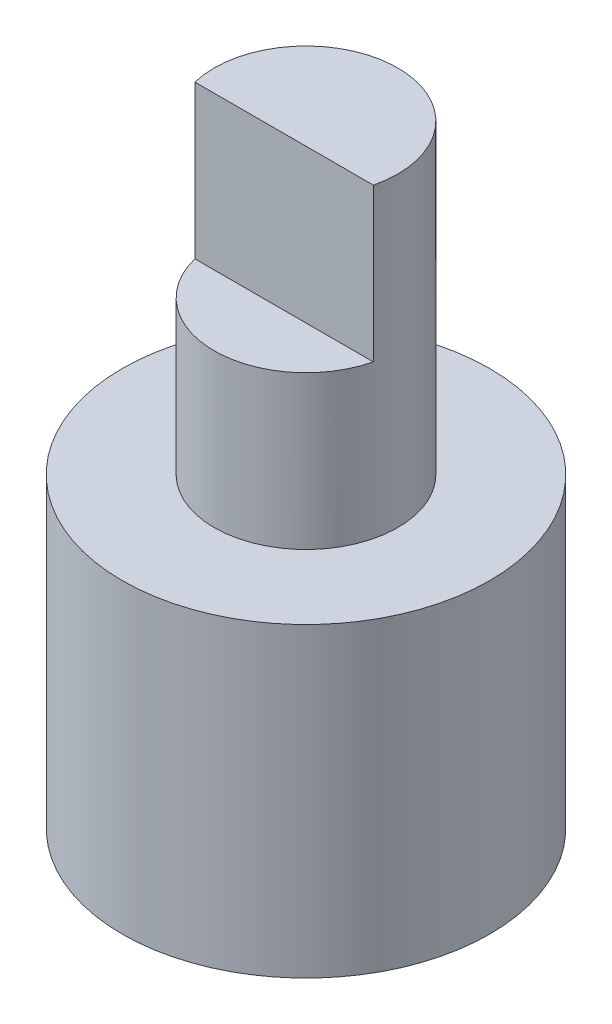
ISO-10303-21;
HEADER;
FILE_DESCRIPTION(('STEP AP214'),'2;1');
FILE_NAME('part.step','',(''),(''),'','','');
FILE_SCHEMA(('AUTOMOTIVE_DESIGN { 1 0 10303 214 1 1 1 1 }'));
ENDSEC;
DATA;
#1=APPLICATION_CONTEXT('core data for automotive mechanical design processes');
#2=APPLICATION_PROTOCOL_DEFINITION('international standard','automotive_design',2000,#1);
#3=PRODUCT_CONTEXT('',#1,'mechanical');
#4=PRODUCT('Part','Part','',(#3));
#5=PRODUCT_RELATED_PRODUCT_CATEGORY('part','',(#4));
#6=PRODUCT_DEFINITION_FORMATION('','',#4);
#7=PRODUCT_DEFINITION_CONTEXT('part definition',#1,'design');
#8=PRODUCT_DEFINITION('design','',#6,#7);
#9=PRODUCT_DEFINITION_SHAPE('','',#8);
#10=(LENGTH_UNIT() NAMED_UNIT(*) SI_UNIT(.MILLI.,.METRE.));
#11=(NAMED_UNIT(*) PLANE_ANGLE_UNIT() SI_UNIT($,.RADIAN.));
#12=(NAMED_UNIT(*) SI_UNIT($,.STERADIAN.) SOLID_ANGLE_UNIT());
#13=UNCERTAINTY_MEASURE_WITH_UNIT(LENGTH_MEASURE(1.E-05),#10,'distance_accuracy_value','');
#14=(GEOMETRIC_REPRESENTATION_CONTEXT(3) GLOBAL_UNCERTAINTY_ASSIGNED_CONTEXT((#13)) GLOBAL_UNIT_ASSIGNED_CONTEXT((#10,
#11,#12)) REPRESENTATION_CONTEXT('',''));
#15=CARTESIAN_POINT('',(0.,0.,0.));
#16=DIRECTION('',(0.,0.,1.));
#17=DIRECTION('',(1.,0.,0.));
#18=AXIS2_PLACEMENT_3D('',#15,#16,#17);
#19=CARTESIAN_POINT('',(0.,5.,0.));
#20=DIRECTION('',(0.,-1.,0.));
#21=DIRECTION('',(0.,0.,-1.));
#22=AXIS2_PLACEMENT_3D('',#19,#20,#21);
#23=CYLINDRICAL_SURFACE('',#22,3.);
#24=CARTESIAN_POINT('',(0.,5.,0.));
#25=DIRECTION('',(0.,1.,0.));
#26=DIRECTION('',(0.,0.,1.));
#27=AXIS2_PLACEMENT_3D('',#24,#25,#26);
#28=CIRCLE('',#27,3.);
#29=CARTESIAN_POINT('',(0.,5.,3.));
#30=VERTEX_POINT('',#29);
#31=EDGE_CURVE('E56',#30,#30,#28,.T.);
#32=ORIENTED_EDGE('',*,*,#31,.F.);
#33=EDGE_LOOP('',(#32));
#34=FACE_BOUND('',#33,.T.);
#35=CARTESIAN_POINT('',(0.,0.,0.));
#36=DIRECTION('',(0.,1.,0.));
#37=DIRECTION('',(0.,0.,1.));
#38=AXIS2_PLACEMENT_3D('',#35,#36,#37);
#39=CIRCLE('',#38,3.);
#40=CARTESIAN_POINT('',(0.,0.,3.));
#41=VERTEX_POINT('',#40);
#42=EDGE_CURVE('E51',#41,#41,#39,.T.);
#43=ORIENTED_EDGE('',*,*,#42,.T.);
#44=EDGE_LOOP('',(#43));
#45=FACE_BOUND('',#44,.T.);
#46=ADVANCED_FACE('F48',(#34,#45),#23,.T.);
#47=CARTESIAN_POINT('',(0.,5.,0.));
#48=DIRECTION('',(0.,1.,0.));
#49=DIRECTION('',(0.,0.,1.));
#50=AXIS2_PLACEMENT_3D('',#47,#48,#49);
#51=PLANE('',#50);
#52=CARTESIAN_POINT('',(0.,5.,0.));
#53=DIRECTION('',(0.,1.,0.));
#54=DIRECTION('',(0.,0.,1.));
#55=AXIS2_PLACEMENT_3D('',#52,#53,#54);
#56=CIRCLE('',#55,1.5);
#57=CARTESIAN_POINT('',(0.,5.,1.5));
#58=VERTEX_POINT('',#57);
#59=EDGE_CURVE('E13',#58,#58,#56,.T.);
#60=ORIENTED_EDGE('',*,*,#59,.F.);
#61=EDGE_LOOP('',(#60));
#62=FACE_BOUND('',#61,.T.);
#63=ORIENTED_EDGE('',*,*,#31,.T.);
#64=EDGE_LOOP('',(#63));
#65=FACE_BOUND('',#64,.T.);
#66=ADVANCED_FACE('F95',(#62,#65),#51,.T.);
#67=CARTESIAN_POINT('',(0.,0.,0.));
#68=DIRECTION('',(0.,1.,0.));
#69=DIRECTION('',(0.,0.,1.));
#70=AXIS2_PLACEMENT_3D('',#67,#68,#69);
#71=PLANE('',#70);
#72=ORIENTED_EDGE('',*,*,#42,.F.);
#73=EDGE_LOOP('',(#72));
#74=FACE_BOUND('',#73,.T.);
#75=ADVANCED_FACE('F101',(#74),#71,.F.);
#76=CARTESIAN_POINT('',(0.,10.,0.));
#77=DIRECTION('',(0.,-1.,0.));
#78=DIRECTION('',(0.,0.,-1.));
#79=AXIS2_PLACEMENT_3D('',#76,#77,#78);
#80=CYLINDRICAL_SURFACE('',#79,1.5);
#81=CARTESIAN_POINT('',(0.,10.,0.));
#82=DIRECTION('',(0.,1.,0.));
#83=DIRECTION('',(0.,0.,1.));
#84=AXIS2_PLACEMENT_3D('',#81,#82,#83);
#85=CIRCLE('',#84,1.5);
#86=CARTESIAN_POINT('',(1.45689367614761,10.,0.357016549197798));
#87=VERTEX_POINT('',#86);
#88=CARTESIAN_POINT('',(-1.45689367614761,10.,0.357016549197798));
#89=VERTEX_POINT('',#88);
#90=EDGE_CURVE('E86',#87,#89,#85,.T.);
#91=ORIENTED_EDGE('',*,*,#90,.F.);
#92=DIRECTION('',(0.,1.,0.));
#93=VECTOR('',#92,1.);
#94=CARTESIAN_POINT('',(1.45689367614761,7.5,0.357016549197798));
#95=LINE('',#94,#93);
#96=CARTESIAN_POINT('',(1.45689367614761,7.5,0.357016549197798));
#97=VERTEX_POINT('',#96);
#98=EDGE_CURVE('E64',#97,#87,#95,.T.);
#99=ORIENTED_EDGE('',*,*,#98,.F.);
#100=CARTESIAN_POINT('',(0.,7.5,0.));
#101=DIRECTION('',(0.,1.,0.));
#102=DIRECTION('',(0.,0.,1.));
#103=AXIS2_PLACEMENT_3D('',#100,#101,#102);
#104=CIRCLE('',#103,1.5);
#105=CARTESIAN_POINT('',(-1.45689367614761,7.5,0.357016549197798));
#106=VERTEX_POINT('',#105);
#107=EDGE_CURVE('E80',#106,#97,#104,.T.);
#108=ORIENTED_EDGE('',*,*,#107,.F.);
#109=DIRECTION('',(0.,1.,0.));
#110=VECTOR('',#109,1.);
#111=CARTESIAN_POINT('',(-1.45689367614761,7.5,0.357016549197798));
#112=LINE('',#111,#110);
#113=EDGE_CURVE('E70',#106,#89,#112,.T.);
#114=ORIENTED_EDGE('',*,*,#113,.T.);
#115=EDGE_LOOP('',(#91,#99,#108,#114));
#116=FACE_BOUND('',#115,.T.);
#117=ORIENTED_EDGE('',*,*,#59,.T.);
#118=EDGE_LOOP('',(#117));
#119=FACE_BOUND('',#118,.T.);
#120=ADVANCED_FACE('F84',(#116,#119),#80,.T.);
#121=CARTESIAN_POINT('',(0.,10.,0.));
#122=DIRECTION('',(0.,1.,0.));
#123=DIRECTION('',(0.,0.,1.));
#124=AXIS2_PLACEMENT_3D('',#121,#122,#123);
#125=PLANE('',#124);
#126=DIRECTION('',(-1.,0.,0.));
#127=VECTOR('',#126,1.);
#128=CARTESIAN_POINT('',(-1.45689367614761,10.,0.357016549197798));
#129=LINE('',#128,#127);
#130=EDGE_CURVE('E75',#87,#89,#129,.T.);
#131=ORIENTED_EDGE('',*,*,#130,.F.);
#132=ORIENTED_EDGE('',*,*,#90,.T.);
#133=EDGE_LOOP('',(#131,#132));
#134=FACE_BOUND('',#133,.T.);
#135=ADVANCED_FACE('F88',(#134),#125,.T.);
#136=CARTESIAN_POINT('',(-1.45689367614761,7.5,0.357016549197798));
#137=DIRECTION('',(0.,0.,-1.));
#138=DIRECTION('',(-1.,0.,0.));
#139=AXIS2_PLACEMENT_3D('',#136,#137,#138);
#140=PLANE('',#139);
#141=ORIENTED_EDGE('',*,*,#130,.T.);
#142=ORIENTED_EDGE('',*,*,#113,.F.);
#143=DIRECTION('',(-1.,0.,0.));
#144=VECTOR('',#143,1.);
#145=CARTESIAN_POINT('',(-1.45689367614761,7.5,0.357016549197798));
#146=LINE('',#145,#144);
#147=EDGE_CURVE('E120',#97,#106,#146,.T.);
#148=ORIENTED_EDGE('',*,*,#147,.F.);
#149=ORIENTED_EDGE('',*,*,#98,.T.);
#150=EDGE_LOOP('',(#141,#142,#148,#149));
#151=FACE_BOUND('',#150,.T.);
#152=ADVANCED_FACE('F76',(#151),#140,.F.);
#153=CARTESIAN_POINT('',(0.,7.5,0.));
#154=DIRECTION('',(0.,1.,0.));
#155=DIRECTION('',(0.,0.,1.));
#156=AXIS2_PLACEMENT_3D('',#153,#154,#155);
#157=PLANE('',#156);
#158=ORIENTED_EDGE('',*,*,#107,.T.);
#159=ORIENTED_EDGE('',*,*,#147,.T.);
#160=EDGE_LOOP('',(#158,#159));
#161=FACE_BOUND('',#160,.T.);
#162=ADVANCED_FACE('F115',(#161),#157,.T.);
#163=CLOSED_SHELL('',(#46,#66,#75,#120,#135,#152,#162));
#164=MANIFOLD_SOLID_BREP('B2',#163);
#165=ADVANCED_BREP_SHAPE_REPRESENTATION('',(#18,#164),#14);
#166=SHAPE_DEFINITION_REPRESENTATION(#9,#165);
ENDSEC;
END-ISO-10303-21;
